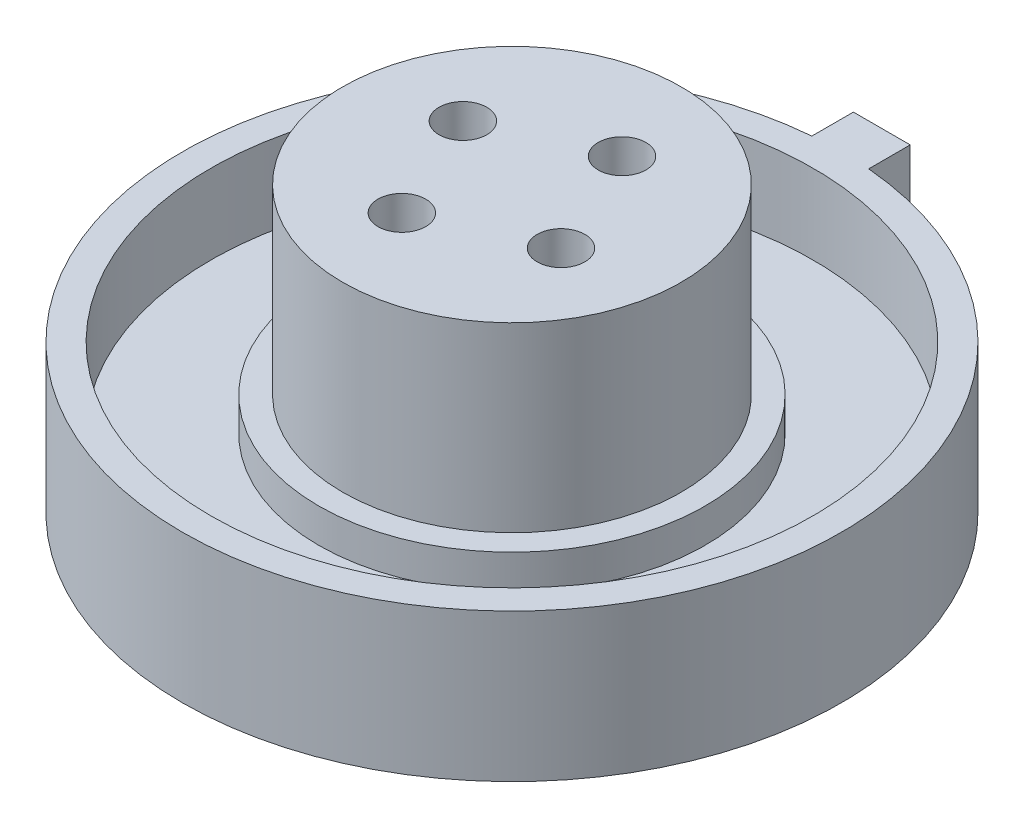
ISO-10303-21;
HEADER;
FILE_DESCRIPTION(('STEP AP214'),'2;1');
FILE_NAME('part.step','',(''),(''),'','','');
FILE_SCHEMA(('AUTOMOTIVE_DESIGN { 1 0 10303 214 1 1 1 1 }'));
ENDSEC;
DATA;
#1=APPLICATION_CONTEXT('core data for automotive mechanical design processes');
#2=APPLICATION_PROTOCOL_DEFINITION('international standard','automotive_design',2000,#1);
#3=PRODUCT_CONTEXT('',#1,'mechanical');
#4=PRODUCT('Part','Part','',(#3));
#5=PRODUCT_RELATED_PRODUCT_CATEGORY('part','',(#4));
#6=PRODUCT_DEFINITION_FORMATION('','',#4);
#7=PRODUCT_DEFINITION_CONTEXT('part definition',#1,'design');
#8=PRODUCT_DEFINITION('design','',#6,#7);
#9=PRODUCT_DEFINITION_SHAPE('','',#8);
#10=(LENGTH_UNIT() NAMED_UNIT(*) SI_UNIT(.MILLI.,.METRE.));
#11=(NAMED_UNIT(*) PLANE_ANGLE_UNIT() SI_UNIT($,.RADIAN.));
#12=(NAMED_UNIT(*) SI_UNIT($,.STERADIAN.) SOLID_ANGLE_UNIT());
#13=UNCERTAINTY_MEASURE_WITH_UNIT(LENGTH_MEASURE(1.E-05),#10,'distance_accuracy_value','');
#14=(GEOMETRIC_REPRESENTATION_CONTEXT(3) GLOBAL_UNCERTAINTY_ASSIGNED_CONTEXT((#13)) GLOBAL_UNIT_ASSIGNED_CONTEXT((#10,
#11,#12)) REPRESENTATION_CONTEXT('',''));
#15=CARTESIAN_POINT('',(0.,0.,0.));
#16=DIRECTION('',(0.,0.,1.));
#17=DIRECTION('',(1.,0.,0.));
#18=AXIS2_PLACEMENT_3D('',#15,#16,#17);
#19=CARTESIAN_POINT('',(0.,6.,0.));
#20=DIRECTION('',(0.,1.,0.));
#21=DIRECTION('',(0.,0.,1.));
#22=AXIS2_PLACEMENT_3D('',#19,#20,#21);
#23=CYLINDRICAL_SURFACE('',#22,17.);
#24=CARTESIAN_POINT('',(0.,6.,0.));
#25=DIRECTION('',(0.,1.,0.));
#26=DIRECTION('',(0.,0.,1.));
#27=AXIS2_PLACEMENT_3D('',#24,#25,#26);
#28=CIRCLE('',#27,17.);
#29=CARTESIAN_POINT('',(0.,6.,17.));
#30=VERTEX_POINT('',#29);
#31=EDGE_CURVE('E127',#30,#30,#28,.T.);
#32=ORIENTED_EDGE('',*,*,#31,.T.);
#33=EDGE_LOOP('',(#32));
#34=FACE_BOUND('',#33,.T.);
#35=CARTESIAN_POINT('',(0.,9.,0.));
#36=DIRECTION('',(0.,1.,0.));
#37=DIRECTION('',(0.,0.,1.));
#38=AXIS2_PLACEMENT_3D('',#35,#36,#37);
#39=CIRCLE('',#38,17.);
#40=CARTESIAN_POINT('',(0.,9.,17.));
#41=VERTEX_POINT('',#40);
#42=EDGE_CURVE('E126',#41,#41,#39,.F.);
#43=ORIENTED_EDGE('',*,*,#42,.T.);
#44=EDGE_LOOP('',(#43));
#45=FACE_BOUND('',#44,.T.);
#46=ADVANCED_FACE('F39',(#34,#45),#23,.T.);
#47=CARTESIAN_POINT('',(0.,13.,0.));
#48=DIRECTION('',(0.,-1.,0.));
#49=DIRECTION('',(0.,0.,-1.));
#50=AXIS2_PLACEMENT_3D('',#47,#48,#49);
#51=CYLINDRICAL_SURFACE('',#50,29.);
#52=CARTESIAN_POINT('',(0.,0.,0.));
#53=DIRECTION('',(0.,1.,0.));
#54=DIRECTION('',(0.,0.,1.));
#55=AXIS2_PLACEMENT_3D('',#52,#53,#54);
#56=CIRCLE('',#55,29.);
#57=CARTESIAN_POINT('',(-2.5,0.,-28.8920404263873));
#58=VERTEX_POINT('',#57);
#59=CARTESIAN_POINT('',(2.5,0.,-28.8920404263873));
#60=VERTEX_POINT('',#59);
#61=EDGE_CURVE('E136',#58,#60,#56,.T.);
#62=ORIENTED_EDGE('',*,*,#61,.T.);
#63=DIRECTION('',(0.,-1.,0.));
#64=VECTOR('',#63,1.);
#65=CARTESIAN_POINT('',(2.5,13.,-28.8920404263873));
#66=LINE('',#65,#64);
#67=CARTESIAN_POINT('',(2.5,13.,-28.8920404263873));
#68=VERTEX_POINT('',#67);
#69=EDGE_CURVE('E61',#60,#68,#66,.F.);
#70=ORIENTED_EDGE('',*,*,#69,.T.);
#71=CARTESIAN_POINT('',(0.,13.,0.));
#72=DIRECTION('',(0.,1.,0.));
#73=DIRECTION('',(0.,0.,1.));
#74=AXIS2_PLACEMENT_3D('',#71,#72,#73);
#75=CIRCLE('',#74,29.);
#76=CARTESIAN_POINT('',(-2.5,13.,-28.8920404263873));
#77=VERTEX_POINT('',#76);
#78=EDGE_CURVE('E49',#77,#68,#75,.T.);
#79=ORIENTED_EDGE('',*,*,#78,.F.);
#80=DIRECTION('',(0.,-1.,0.));
#81=VECTOR('',#80,1.);
#82=CARTESIAN_POINT('',(-2.5,13.,-28.8920404263873));
#83=LINE('',#82,#81);
#84=EDGE_CURVE('E87',#77,#58,#83,.T.);
#85=ORIENTED_EDGE('',*,*,#84,.T.);
#86=EDGE_LOOP('',(#62,#70,#79,#85));
#87=FACE_BOUND('',#86,.T.);
#88=ADVANCED_FACE('F41',(#87),#51,.T.);
#89=CARTESIAN_POINT('',(0.,13.,0.));
#90=DIRECTION('',(0.,1.,0.));
#91=DIRECTION('',(0.,0.,1.));
#92=AXIS2_PLACEMENT_3D('',#89,#90,#91);
#93=PLANE('',#92);
#94=ORIENTED_EDGE('',*,*,#78,.T.);
#95=DIRECTION('',(0.,0.,1.));
#96=VECTOR('',#95,1.);
#97=CARTESIAN_POINT('',(2.5,13.,-27.9216765532908));
#98=LINE('',#97,#96);
#99=CARTESIAN_POINT('',(2.50000000000001,13.,-32.5465495604647));
#100=VERTEX_POINT('',#99);
#101=EDGE_CURVE('E92',#100,#68,#98,.T.);
#102=ORIENTED_EDGE('',*,*,#101,.F.);
#103=DIRECTION('',(1.,0.,0.));
#104=VECTOR('',#103,1.);
#105=CARTESIAN_POINT('',(-2.49999999999999,13.,-32.5465495604647));
#106=LINE('',#105,#104);
#107=CARTESIAN_POINT('',(-2.49999999999999,13.,-32.5465495604647));
#108=VERTEX_POINT('',#107);
#109=EDGE_CURVE('E91',#108,#100,#106,.T.);
#110=ORIENTED_EDGE('',*,*,#109,.F.);
#111=DIRECTION('',(0.,0.,-1.));
#112=VECTOR('',#111,1.);
#113=CARTESIAN_POINT('',(-2.5,13.,-27.9216765532908));
#114=LINE('',#113,#112);
#115=EDGE_CURVE('E81',#77,#108,#114,.T.);
#116=ORIENTED_EDGE('',*,*,#115,.F.);
#117=EDGE_LOOP('',(#94,#102,#110,#116));
#118=FACE_BOUND('',#117,.T.);
#119=CARTESIAN_POINT('',(0.,13.,0.));
#120=DIRECTION('',(0.,1.,0.));
#121=DIRECTION('',(0.,0.,1.));
#122=AXIS2_PLACEMENT_3D('',#119,#120,#121);
#123=CIRCLE('',#122,26.5);
#124=CARTESIAN_POINT('',(0.,13.,26.5));
#125=VERTEX_POINT('',#124);
#126=EDGE_CURVE('E131',#125,#125,#123,.T.);
#127=ORIENTED_EDGE('',*,*,#126,.F.);
#128=EDGE_LOOP('',(#127));
#129=FACE_BOUND('',#128,.T.);
#130=ADVANCED_FACE('F103',(#118,#129),#93,.T.);
#131=CARTESIAN_POINT('',(0.,0.,0.));
#132=DIRECTION('',(0.,1.,0.));
#133=DIRECTION('',(0.,0.,1.));
#134=AXIS2_PLACEMENT_3D('',#131,#132,#133);
#135=PLANE('',#134);
#136=CARTESIAN_POINT('',(7.002624358321,0.,2.68574982011531));
#137=DIRECTION('',(0.,-1.,0.));
#138=DIRECTION('',(0.,0.,-1.));
#139=AXIS2_PLACEMENT_3D('',#136,#137,#138);
#140=CIRCLE('',#139,2.1);
#141=CARTESIAN_POINT('',(7.002624358321,0.,0.585749820115314));
#142=VERTEX_POINT('',#141);
#143=EDGE_CURVE('E152',#142,#142,#140,.T.);
#144=ORIENTED_EDGE('',*,*,#143,.F.);
#145=EDGE_LOOP('',(#144));
#146=FACE_BOUND('',#145,.T.);
#147=CARTESIAN_POINT('',(-7.002624358321,0.,-2.68574982011531));
#148=DIRECTION('',(0.,-1.,0.));
#149=DIRECTION('',(0.,0.,-1.));
#150=AXIS2_PLACEMENT_3D('',#147,#148,#149);
#151=CIRCLE('',#150,2.1);
#152=CARTESIAN_POINT('',(-7.002624358321,0.,-4.78574982011532));
#153=VERTEX_POINT('',#152);
#154=EDGE_CURVE('E210',#153,#153,#151,.T.);
#155=ORIENTED_EDGE('',*,*,#154,.F.);
#156=EDGE_LOOP('',(#155));
#157=FACE_BOUND('',#156,.T.);
#158=CARTESIAN_POINT('',(2.68574982011534,0.,-7.00262435832098));
#159=DIRECTION('',(0.,-1.,0.));
#160=DIRECTION('',(0.,0.,-1.));
#161=AXIS2_PLACEMENT_3D('',#158,#159,#160);
#162=CIRCLE('',#161,2.1);
#163=CARTESIAN_POINT('',(2.68574982011534,0.,-9.10262435832098));
#164=VERTEX_POINT('',#163);
#165=EDGE_CURVE('E214',#164,#164,#162,.T.);
#166=ORIENTED_EDGE('',*,*,#165,.F.);
#167=EDGE_LOOP('',(#166));
#168=FACE_BOUND('',#167,.T.);
#169=CARTESIAN_POINT('',(-2.68574982011534,0.,7.00262435832099));
#170=DIRECTION('',(0.,-1.,0.));
#171=DIRECTION('',(0.,0.,-1.));
#172=AXIS2_PLACEMENT_3D('',#169,#170,#171);
#173=CIRCLE('',#172,2.1);
#174=CARTESIAN_POINT('',(-2.68574982011534,0.,4.90262435832099));
#175=VERTEX_POINT('',#174);
#176=EDGE_CURVE('E170',#175,#175,#173,.T.);
#177=ORIENTED_EDGE('',*,*,#176,.F.);
#178=EDGE_LOOP('',(#177));
#179=FACE_BOUND('',#178,.T.);
#180=ORIENTED_EDGE('',*,*,#61,.F.);
#181=DIRECTION('',(0.,0.,-1.));
#182=VECTOR('',#181,1.);
#183=CARTESIAN_POINT('',(-2.5,0.,-27.9216765532908));
#184=LINE('',#183,#182);
#185=CARTESIAN_POINT('',(-2.49999999999999,0.,-32.5465495604647));
#186=VERTEX_POINT('',#185);
#187=EDGE_CURVE('E114',#58,#186,#184,.T.);
#188=ORIENTED_EDGE('',*,*,#187,.T.);
#189=DIRECTION('',(1.,0.,0.));
#190=VECTOR('',#189,1.);
#191=CARTESIAN_POINT('',(-2.49999999999999,0.,-32.5465495604647));
#192=LINE('',#191,#190);
#193=CARTESIAN_POINT('',(2.50000000000001,0.,-32.5465495604647));
#194=VERTEX_POINT('',#193);
#195=EDGE_CURVE('E98',#186,#194,#192,.T.);
#196=ORIENTED_EDGE('',*,*,#195,.T.);
#197=DIRECTION('',(0.,0.,1.));
#198=VECTOR('',#197,1.);
#199=CARTESIAN_POINT('',(2.5,0.,-27.9216765532908));
#200=LINE('',#199,#198);
#201=EDGE_CURVE('E110',#194,#60,#200,.T.);
#202=ORIENTED_EDGE('',*,*,#201,.T.);
#203=EDGE_LOOP('',(#180,#188,#196,#202));
#204=FACE_BOUND('',#203,.T.);
#205=ADVANCED_FACE('F177',(#146,#157,#168,#179,#204),#135,.F.);
#206=CARTESIAN_POINT('',(0.,6.,0.));
#207=DIRECTION('',(0.,1.,0.));
#208=DIRECTION('',(0.,0.,1.));
#209=AXIS2_PLACEMENT_3D('',#206,#207,#208);
#210=CYLINDRICAL_SURFACE('',#209,26.5);
#211=CARTESIAN_POINT('',(0.,6.,0.));
#212=DIRECTION('',(0.,1.,0.));
#213=DIRECTION('',(0.,0.,1.));
#214=AXIS2_PLACEMENT_3D('',#211,#212,#213);
#215=CIRCLE('',#214,26.5);
#216=CARTESIAN_POINT('',(0.,6.,26.5));
#217=VERTEX_POINT('',#216);
#218=EDGE_CURVE('E132',#217,#217,#215,.T.);
#219=ORIENTED_EDGE('',*,*,#218,.F.);
#220=EDGE_LOOP('',(#219));
#221=FACE_BOUND('',#220,.T.);
#222=ORIENTED_EDGE('',*,*,#126,.T.);
#223=EDGE_LOOP('',(#222));
#224=FACE_BOUND('',#223,.T.);
#225=ADVANCED_FACE('F196',(#221,#224),#210,.F.);
#226=CARTESIAN_POINT('',(0.,6.,0.));
#227=DIRECTION('',(0.,1.,0.));
#228=DIRECTION('',(0.,0.,1.));
#229=AXIS2_PLACEMENT_3D('',#226,#227,#228);
#230=PLANE('',#229);
#231=ORIENTED_EDGE('',*,*,#31,.F.);
#232=EDGE_LOOP('',(#231));
#233=FACE_BOUND('',#232,.T.);
#234=ORIENTED_EDGE('',*,*,#218,.T.);
#235=EDGE_LOOP('',(#234));
#236=FACE_BOUND('',#235,.T.);
#237=ADVANCED_FACE('F193',(#233,#236),#230,.T.);
#238=CARTESIAN_POINT('',(0.,9.,0.));
#239=DIRECTION('',(0.,1.,0.));
#240=DIRECTION('',(0.,0.,1.));
#241=AXIS2_PLACEMENT_3D('',#238,#239,#240);
#242=PLANE('',#241);
#243=CARTESIAN_POINT('',(0.,9.,0.));
#244=DIRECTION('',(0.,1.,0.));
#245=DIRECTION('',(0.,0.,1.));
#246=AXIS2_PLACEMENT_3D('',#243,#244,#245);
#247=CIRCLE('',#246,14.9);
#248=CARTESIAN_POINT('',(0.,9.,14.9));
#249=VERTEX_POINT('',#248);
#250=EDGE_CURVE('E11',#249,#249,#247,.T.);
#251=ORIENTED_EDGE('',*,*,#250,.F.);
#252=EDGE_LOOP('',(#251));
#253=FACE_BOUND('',#252,.T.);
#254=ORIENTED_EDGE('',*,*,#42,.F.);
#255=EDGE_LOOP('',(#254));
#256=FACE_BOUND('',#255,.T.);
#257=ADVANCED_FACE('F191',(#253,#256),#242,.T.);
#258=CARTESIAN_POINT('',(2.5,13.,-27.9216765532908));
#259=DIRECTION('',(1.,0.,0.));
#260=DIRECTION('',(0.,0.,-1.));
#261=AXIS2_PLACEMENT_3D('',#258,#259,#260);
#262=PLANE('',#261);
#263=ORIENTED_EDGE('',*,*,#69,.F.);
#264=ORIENTED_EDGE('',*,*,#201,.F.);
#265=DIRECTION('',(0.,-1.,0.));
#266=VECTOR('',#265,1.);
#267=CARTESIAN_POINT('',(2.50000000000001,13.,-32.5465495604647));
#268=LINE('',#267,#266);
#269=EDGE_CURVE('E100',#100,#194,#268,.T.);
#270=ORIENTED_EDGE('',*,*,#269,.F.);
#271=ORIENTED_EDGE('',*,*,#101,.T.);
#272=EDGE_LOOP('',(#263,#264,#270,#271));
#273=FACE_BOUND('',#272,.T.);
#274=ADVANCED_FACE('F174',(#273),#262,.T.);
#275=CARTESIAN_POINT('',(-2.5,13.,-27.9216765532908));
#276=DIRECTION('',(-1.,0.,0.));
#277=DIRECTION('',(0.,0.,1.));
#278=AXIS2_PLACEMENT_3D('',#275,#276,#277);
#279=PLANE('',#278);
#280=ORIENTED_EDGE('',*,*,#84,.F.);
#281=ORIENTED_EDGE('',*,*,#115,.T.);
#282=DIRECTION('',(0.,-1.,0.));
#283=VECTOR('',#282,1.);
#284=CARTESIAN_POINT('',(-2.49999999999999,13.,-32.5465495604647));
#285=LINE('',#284,#283);
#286=EDGE_CURVE('E85',#108,#186,#285,.T.);
#287=ORIENTED_EDGE('',*,*,#286,.T.);
#288=ORIENTED_EDGE('',*,*,#187,.F.);
#289=EDGE_LOOP('',(#280,#281,#287,#288));
#290=FACE_BOUND('',#289,.T.);
#291=ADVANCED_FACE('F83',(#290),#279,.T.);
#292=CARTESIAN_POINT('',(-2.49999999999999,13.,-32.5465495604647));
#293=DIRECTION('',(0.,0.,-1.));
#294=DIRECTION('',(-1.,0.,0.));
#295=AXIS2_PLACEMENT_3D('',#292,#293,#294);
#296=PLANE('',#295);
#297=ORIENTED_EDGE('',*,*,#195,.F.);
#298=ORIENTED_EDGE('',*,*,#286,.F.);
#299=ORIENTED_EDGE('',*,*,#109,.T.);
#300=ORIENTED_EDGE('',*,*,#269,.T.);
#301=EDGE_LOOP('',(#297,#298,#299,#300));
#302=FACE_BOUND('',#301,.T.);
#303=ADVANCED_FACE('F96',(#302),#296,.T.);
#304=CARTESIAN_POINT('',(0.,25.,0.));
#305=DIRECTION('',(0.,-1.,0.));
#306=DIRECTION('',(0.,0.,-1.));
#307=AXIS2_PLACEMENT_3D('',#304,#305,#306);
#308=CYLINDRICAL_SURFACE('',#307,14.9);
#309=CARTESIAN_POINT('',(0.,25.,0.));
#310=DIRECTION('',(0.,1.,0.));
#311=DIRECTION('',(0.,0.,1.));
#312=AXIS2_PLACEMENT_3D('',#309,#310,#311);
#313=CIRCLE('',#312,14.9);
#314=CARTESIAN_POINT('',(0.,25.,14.9));
#315=VERTEX_POINT('',#314);
#316=EDGE_CURVE('E115',#315,#315,#313,.T.);
#317=ORIENTED_EDGE('',*,*,#316,.F.);
#318=EDGE_LOOP('',(#317));
#319=FACE_BOUND('',#318,.T.);
#320=ORIENTED_EDGE('',*,*,#250,.T.);
#321=EDGE_LOOP('',(#320));
#322=FACE_BOUND('',#321,.T.);
#323=ADVANCED_FACE('F246',(#319,#322),#308,.T.);
#324=CARTESIAN_POINT('',(0.,25.,0.));
#325=DIRECTION('',(0.,1.,0.));
#326=DIRECTION('',(0.,0.,1.));
#327=AXIS2_PLACEMENT_3D('',#324,#325,#326);
#328=PLANE('',#327);
#329=CARTESIAN_POINT('',(7.002624358321,25.,2.68574982011531));
#330=DIRECTION('',(0.,1.,0.));
#331=DIRECTION('',(0.,0.,1.));
#332=AXIS2_PLACEMENT_3D('',#329,#330,#331);
#333=CIRCLE('',#332,2.1);
#334=CARTESIAN_POINT('',(7.002624358321,25.,4.78574982011532));
#335=VERTEX_POINT('',#334);
#336=EDGE_CURVE('E43',#335,#335,#333,.T.);
#337=ORIENTED_EDGE('',*,*,#336,.F.);
#338=EDGE_LOOP('',(#337));
#339=FACE_BOUND('',#338,.T.);
#340=CARTESIAN_POINT('',(-7.002624358321,25.,-2.68574982011531));
#341=DIRECTION('',(0.,1.,0.));
#342=DIRECTION('',(0.,0.,1.));
#343=AXIS2_PLACEMENT_3D('',#340,#341,#342);
#344=CIRCLE('',#343,2.1);
#345=CARTESIAN_POINT('',(-7.002624358321,25.,-0.585749820115314));
#346=VERTEX_POINT('',#345);
#347=EDGE_CURVE('E155',#346,#346,#344,.T.);
#348=ORIENTED_EDGE('',*,*,#347,.F.);
#349=EDGE_LOOP('',(#348));
#350=FACE_BOUND('',#349,.T.);
#351=CARTESIAN_POINT('',(2.68574982011534,25.,-7.00262435832098));
#352=DIRECTION('',(0.,1.,0.));
#353=DIRECTION('',(0.,0.,1.));
#354=AXIS2_PLACEMENT_3D('',#351,#352,#353);
#355=CIRCLE('',#354,2.1);
#356=CARTESIAN_POINT('',(2.68574982011534,25.,-4.90262435832098));
#357=VERTEX_POINT('',#356);
#358=EDGE_CURVE('E151',#357,#357,#355,.T.);
#359=ORIENTED_EDGE('',*,*,#358,.F.);
#360=EDGE_LOOP('',(#359));
#361=FACE_BOUND('',#360,.T.);
#362=CARTESIAN_POINT('',(-2.68574982011534,25.,7.00262435832099));
#363=DIRECTION('',(0.,1.,0.));
#364=DIRECTION('',(0.,0.,1.));
#365=AXIS2_PLACEMENT_3D('',#362,#363,#364);
#366=CIRCLE('',#365,2.1);
#367=CARTESIAN_POINT('',(-2.68574982011534,25.,9.10262435832099));
#368=VERTEX_POINT('',#367);
#369=EDGE_CURVE('E147',#368,#368,#366,.T.);
#370=ORIENTED_EDGE('',*,*,#369,.F.);
#371=EDGE_LOOP('',(#370));
#372=FACE_BOUND('',#371,.T.);
#373=ORIENTED_EDGE('',*,*,#316,.T.);
#374=EDGE_LOOP('',(#373));
#375=FACE_BOUND('',#374,.T.);
#376=ADVANCED_FACE('F242',(#339,#350,#361,#372,#375),#328,.T.);
#377=CARTESIAN_POINT('',(-2.68574982011534,30.,7.00262435832099));
#378=DIRECTION('',(0.,-1.,0.));
#379=DIRECTION('',(0.,0.,-1.));
#380=AXIS2_PLACEMENT_3D('',#377,#378,#379);
#381=CYLINDRICAL_SURFACE('',#380,2.1);
#382=ORIENTED_EDGE('',*,*,#369,.T.);
#383=EDGE_LOOP('',(#382));
#384=FACE_BOUND('',#383,.T.);
#385=ORIENTED_EDGE('',*,*,#176,.T.);
#386=EDGE_LOOP('',(#385));
#387=FACE_BOUND('',#386,.T.);
#388=ADVANCED_FACE('F238',(#384,#387),#381,.F.);
#389=CARTESIAN_POINT('',(2.68574982011534,30.,-7.00262435832098));
#390=DIRECTION('',(0.,-1.,0.));
#391=DIRECTION('',(0.,0.,-1.));
#392=AXIS2_PLACEMENT_3D('',#389,#390,#391);
#393=CYLINDRICAL_SURFACE('',#392,2.1);
#394=ORIENTED_EDGE('',*,*,#358,.T.);
#395=EDGE_LOOP('',(#394));
#396=FACE_BOUND('',#395,.T.);
#397=ORIENTED_EDGE('',*,*,#165,.T.);
#398=EDGE_LOOP('',(#397));
#399=FACE_BOUND('',#398,.T.);
#400=ADVANCED_FACE('F233',(#396,#399),#393,.F.);
#401=CARTESIAN_POINT('',(-7.002624358321,30.,-2.68574982011531));
#402=DIRECTION('',(0.,-1.,0.));
#403=DIRECTION('',(0.,0.,-1.));
#404=AXIS2_PLACEMENT_3D('',#401,#402,#403);
#405=CYLINDRICAL_SURFACE('',#404,2.1);
#406=ORIENTED_EDGE('',*,*,#347,.T.);
#407=EDGE_LOOP('',(#406));
#408=FACE_BOUND('',#407,.T.);
#409=ORIENTED_EDGE('',*,*,#154,.T.);
#410=EDGE_LOOP('',(#409));
#411=FACE_BOUND('',#410,.T.);
#412=ADVANCED_FACE('F228',(#408,#411),#405,.F.);
#413=CARTESIAN_POINT('',(7.002624358321,30.,2.68574982011531));
#414=DIRECTION('',(0.,-1.,0.));
#415=DIRECTION('',(0.,0.,-1.));
#416=AXIS2_PLACEMENT_3D('',#413,#414,#415);
#417=CYLINDRICAL_SURFACE('',#416,2.1);
#418=ORIENTED_EDGE('',*,*,#336,.T.);
#419=EDGE_LOOP('',(#418));
#420=FACE_BOUND('',#419,.T.);
#421=ORIENTED_EDGE('',*,*,#143,.T.);
#422=EDGE_LOOP('',(#421));
#423=FACE_BOUND('',#422,.T.);
#424=ADVANCED_FACE('F226',(#420,#423),#417,.F.);
#425=CLOSED_SHELL('',(#46,#88,#130,#205,#225,#237,#257,#274,#291,#303,#323,#376,#388,#400,#412,#424));
#426=MANIFOLD_SOLID_BREP('B2',#425);
#427=ADVANCED_BREP_SHAPE_REPRESENTATION('',(#18,#426),#14);
#428=SHAPE_DEFINITION_REPRESENTATION(#9,#427);
ENDSEC;
END-ISO-10303-21;
